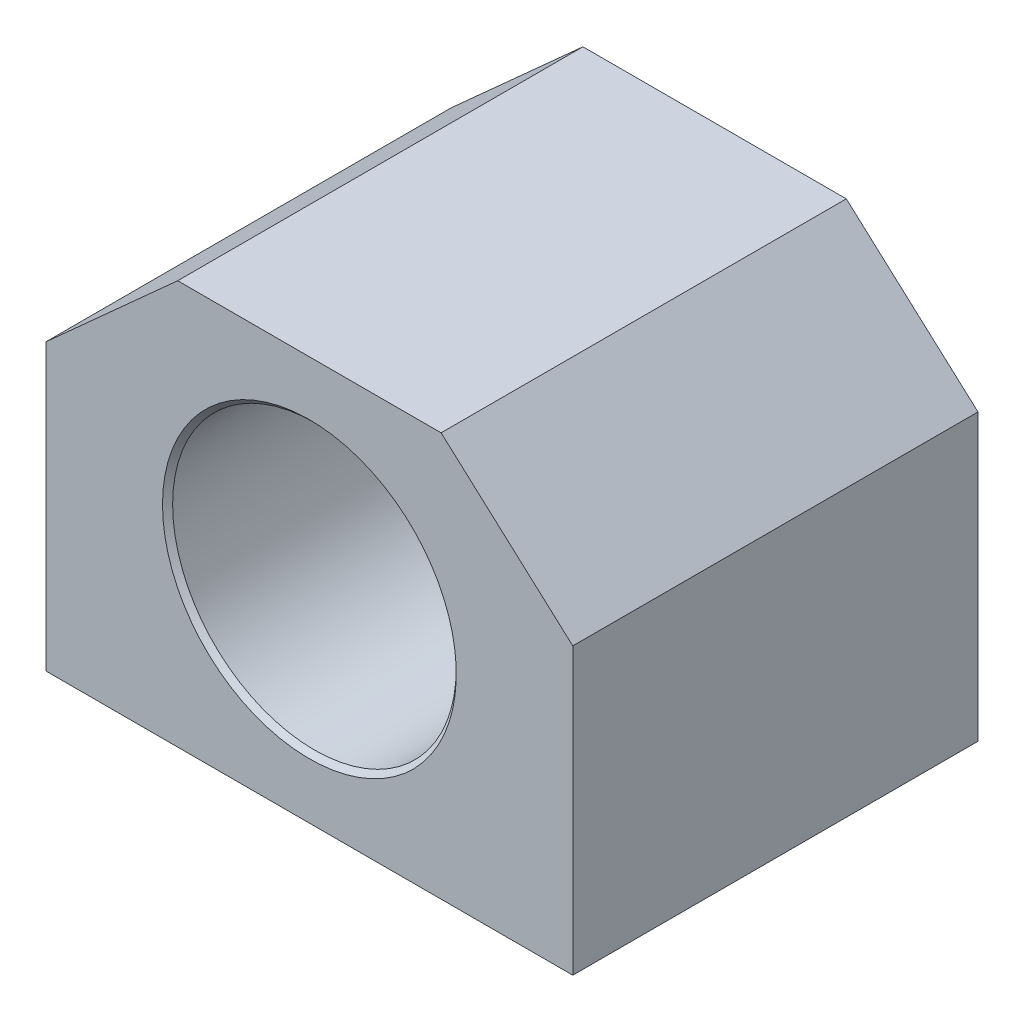
ISO-10303-21;
HEADER;
FILE_DESCRIPTION(('STEP AP214'),'2;1');
FILE_NAME('part.step','',(''),(''),'','','');
FILE_SCHEMA(('AUTOMOTIVE_DESIGN { 1 0 10303 214 1 1 1 1 }'));
ENDSEC;
DATA;
#1=APPLICATION_CONTEXT('core data for automotive mechanical design processes');
#2=APPLICATION_PROTOCOL_DEFINITION('international standard','automotive_design',2000,#1);
#3=PRODUCT_CONTEXT('',#1,'mechanical');
#4=PRODUCT('Part','Part','',(#3));
#5=PRODUCT_RELATED_PRODUCT_CATEGORY('part','',(#4));
#6=PRODUCT_DEFINITION_FORMATION('','',#4);
#7=PRODUCT_DEFINITION_CONTEXT('part definition',#1,'design');
#8=PRODUCT_DEFINITION('design','',#6,#7);
#9=PRODUCT_DEFINITION_SHAPE('','',#8);
#10=(LENGTH_UNIT() NAMED_UNIT(*) SI_UNIT(.MILLI.,.METRE.));
#11=(NAMED_UNIT(*) PLANE_ANGLE_UNIT() SI_UNIT($,.RADIAN.));
#12=(NAMED_UNIT(*) SI_UNIT($,.STERADIAN.) SOLID_ANGLE_UNIT());
#13=UNCERTAINTY_MEASURE_WITH_UNIT(LENGTH_MEASURE(1.E-05),#10,'distance_accuracy_value','');
#14=(GEOMETRIC_REPRESENTATION_CONTEXT(3) GLOBAL_UNCERTAINTY_ASSIGNED_CONTEXT((#13)) GLOBAL_UNIT_ASSIGNED_CONTEXT((#10,
#11,#12)) REPRESENTATION_CONTEXT('',''));
#15=CARTESIAN_POINT('',(0.,0.,0.));
#16=DIRECTION('',(0.,0.,1.));
#17=DIRECTION('',(1.,0.,0.));
#18=AXIS2_PLACEMENT_3D('',#15,#16,#17);
#19=CARTESIAN_POINT('',(-26.,0.,20.));
#20=DIRECTION('',(1.,0.,0.));
#21=DIRECTION('',(0.,0.,-1.));
#22=AXIS2_PLACEMENT_3D('',#19,#20,#21);
#23=PLANE('',#22);
#24=DIRECTION('',(0.,-1.,0.));
#25=VECTOR('',#24,1.);
#26=CARTESIAN_POINT('',(-26.,0.,-20.));
#27=LINE('',#26,#25);
#28=CARTESIAN_POINT('',(-26.,28.15462548614,-20.));
#29=VERTEX_POINT('',#28);
#30=CARTESIAN_POINT('',(-26.,0.,-20.));
#31=VERTEX_POINT('',#30);
#32=EDGE_CURVE('E136',#29,#31,#27,.T.);
#33=ORIENTED_EDGE('',*,*,#32,.T.);
#34=DIRECTION('',(0.,0.,-1.));
#35=VECTOR('',#34,1.);
#36=CARTESIAN_POINT('',(-26.,0.,20.));
#37=LINE('',#36,#35);
#38=CARTESIAN_POINT('',(-26.,0.,20.));
#39=VERTEX_POINT('',#38);
#40=EDGE_CURVE('E154',#39,#31,#37,.T.);
#41=ORIENTED_EDGE('',*,*,#40,.F.);
#42=DIRECTION('',(0.,-1.,0.));
#43=VECTOR('',#42,1.);
#44=CARTESIAN_POINT('',(-26.,0.,20.));
#45=LINE('',#44,#43);
#46=CARTESIAN_POINT('',(-26.,28.15462548614,20.));
#47=VERTEX_POINT('',#46);
#48=EDGE_CURVE('E147',#47,#39,#45,.T.);
#49=ORIENTED_EDGE('',*,*,#48,.F.);
#50=DIRECTION('',(0.,0.,-1.));
#51=VECTOR('',#50,1.);
#52=CARTESIAN_POINT('',(-26.,28.15462548614,20.));
#53=LINE('',#52,#51);
#54=EDGE_CURVE('E132',#47,#29,#53,.T.);
#55=ORIENTED_EDGE('',*,*,#54,.T.);
#56=EDGE_LOOP('',(#33,#41,#49,#55));
#57=FACE_BOUND('',#56,.T.);
#58=ADVANCED_FACE('F46',(#57),#23,.F.);
#59=CARTESIAN_POINT('',(26.,0.,20.));
#60=DIRECTION('',(0.,1.,0.));
#61=DIRECTION('',(0.,0.,1.));
#62=AXIS2_PLACEMENT_3D('',#59,#60,#61);
#63=PLANE('',#62);
#64=CARTESIAN_POINT('',(20.,0.,12.));
#65=DIRECTION('',(0.,-1.,0.));
#66=DIRECTION('',(0.,0.,-1.));
#67=AXIS2_PLACEMENT_3D('',#64,#65,#66);
#68=CIRCLE('',#67,2.09999999999999);
#69=CARTESIAN_POINT('',(20.,0.,9.90000000000001));
#70=VERTEX_POINT('',#69);
#71=EDGE_CURVE('E394',#70,#70,#68,.T.);
#72=ORIENTED_EDGE('',*,*,#71,.F.);
#73=EDGE_LOOP('',(#72));
#74=FACE_BOUND('',#73,.T.);
#75=CARTESIAN_POINT('',(-20.,0.,12.));
#76=DIRECTION('',(0.,-1.,0.));
#77=DIRECTION('',(0.,0.,-1.));
#78=AXIS2_PLACEMENT_3D('',#75,#76,#77);
#79=CIRCLE('',#78,2.09999999999999);
#80=CARTESIAN_POINT('',(-20.,0.,9.90000000000001));
#81=VERTEX_POINT('',#80);
#82=EDGE_CURVE('E396',#81,#81,#79,.T.);
#83=ORIENTED_EDGE('',*,*,#82,.F.);
#84=EDGE_LOOP('',(#83));
#85=FACE_BOUND('',#84,.T.);
#86=CARTESIAN_POINT('',(-20.,0.,-12.));
#87=DIRECTION('',(0.,-1.,0.));
#88=DIRECTION('',(0.,0.,-1.));
#89=AXIS2_PLACEMENT_3D('',#86,#87,#88);
#90=CIRCLE('',#89,2.09999999999999);
#91=CARTESIAN_POINT('',(-20.,0.,-14.1));
#92=VERTEX_POINT('',#91);
#93=EDGE_CURVE('E404',#92,#92,#90,.T.);
#94=ORIENTED_EDGE('',*,*,#93,.F.);
#95=EDGE_LOOP('',(#94));
#96=FACE_BOUND('',#95,.T.);
#97=CARTESIAN_POINT('',(20.,0.,-12.));
#98=DIRECTION('',(0.,-1.,0.));
#99=DIRECTION('',(0.,0.,-1.));
#100=AXIS2_PLACEMENT_3D('',#97,#98,#99);
#101=CIRCLE('',#100,2.09999999999999);
#102=CARTESIAN_POINT('',(20.,0.,-14.1));
#103=VERTEX_POINT('',#102);
#104=EDGE_CURVE('E410',#103,#103,#101,.T.);
#105=ORIENTED_EDGE('',*,*,#104,.F.);
#106=EDGE_LOOP('',(#105));
#107=FACE_BOUND('',#106,.T.);
#108=DIRECTION('',(1.,0.,0.));
#109=VECTOR('',#108,1.);
#110=CARTESIAN_POINT('',(26.,0.,-20.));
#111=LINE('',#110,#109);
#112=CARTESIAN_POINT('',(26.,0.,-20.));
#113=VERTEX_POINT('',#112);
#114=EDGE_CURVE('E139',#31,#113,#111,.T.);
#115=ORIENTED_EDGE('',*,*,#114,.T.);
#116=DIRECTION('',(0.,0.,-1.));
#117=VECTOR('',#116,1.);
#118=CARTESIAN_POINT('',(26.,0.,20.));
#119=LINE('',#118,#117);
#120=CARTESIAN_POINT('',(26.,0.,20.));
#121=VERTEX_POINT('',#120);
#122=EDGE_CURVE('E151',#121,#113,#119,.T.);
#123=ORIENTED_EDGE('',*,*,#122,.F.);
#124=DIRECTION('',(1.,0.,0.));
#125=VECTOR('',#124,1.);
#126=CARTESIAN_POINT('',(26.,0.,20.));
#127=LINE('',#126,#125);
#128=EDGE_CURVE('E103',#39,#121,#127,.T.);
#129=ORIENTED_EDGE('',*,*,#128,.F.);
#130=ORIENTED_EDGE('',*,*,#40,.T.);
#131=EDGE_LOOP('',(#115,#123,#129,#130));
#132=FACE_BOUND('',#131,.T.);
#133=ADVANCED_FACE('F192',(#74,#85,#96,#107,#132),#63,.F.);
#134=CARTESIAN_POINT('',(26.,28.15462548614,20.));
#135=DIRECTION('',(-1.,0.,0.));
#136=DIRECTION('',(0.,-1.,0.));
#137=AXIS2_PLACEMENT_3D('',#134,#135,#136);
#138=PLANE('',#137);
#139=DIRECTION('',(0.,1.,0.));
#140=VECTOR('',#139,1.);
#141=CARTESIAN_POINT('',(26.,28.15462548614,-20.));
#142=LINE('',#141,#140);
#143=CARTESIAN_POINT('',(26.,28.15462548614,-20.));
#144=VERTEX_POINT('',#143);
#145=EDGE_CURVE('E142',#113,#144,#142,.T.);
#146=ORIENTED_EDGE('',*,*,#145,.T.);
#147=DIRECTION('',(0.,0.,-1.));
#148=VECTOR('',#147,1.);
#149=CARTESIAN_POINT('',(26.,28.15462548614,20.));
#150=LINE('',#149,#148);
#151=CARTESIAN_POINT('',(26.,28.15462548614,20.));
#152=VERTEX_POINT('',#151);
#153=EDGE_CURVE('E127',#152,#144,#150,.T.);
#154=ORIENTED_EDGE('',*,*,#153,.F.);
#155=DIRECTION('',(0.,1.,0.));
#156=VECTOR('',#155,1.);
#157=CARTESIAN_POINT('',(26.,28.15462548614,20.));
#158=LINE('',#157,#156);
#159=EDGE_CURVE('E118',#121,#152,#158,.T.);
#160=ORIENTED_EDGE('',*,*,#159,.F.);
#161=ORIENTED_EDGE('',*,*,#122,.T.);
#162=EDGE_LOOP('',(#146,#154,#160,#161));
#163=FACE_BOUND('',#162,.T.);
#164=ADVANCED_FACE('F197',(#163),#138,.F.);
#165=CARTESIAN_POINT('',(13.,39.87,20.));
#166=DIRECTION('',(-0.66944997222057,-0.742857142857143,0.));
#167=DIRECTION('',(0.742857142857143,-0.66944997222057,0.));
#168=AXIS2_PLACEMENT_3D('',#165,#166,#167);
#169=PLANE('',#168);
#170=DIRECTION('',(-0.742857142857143,0.66944997222057,0.));
#171=VECTOR('',#170,1.);
#172=CARTESIAN_POINT('',(13.,39.87,-20.));
#173=LINE('',#172,#171);
#174=CARTESIAN_POINT('',(13.,39.87,-20.));
#175=VERTEX_POINT('',#174);
#176=EDGE_CURVE('E126',#144,#175,#173,.T.);
#177=ORIENTED_EDGE('',*,*,#176,.T.);
#178=DIRECTION('',(0.,0.,-1.));
#179=VECTOR('',#178,1.);
#180=CARTESIAN_POINT('',(13.,39.87,20.));
#181=LINE('',#180,#179);
#182=CARTESIAN_POINT('',(13.,39.87,20.));
#183=VERTEX_POINT('',#182);
#184=EDGE_CURVE('E123',#183,#175,#181,.T.);
#185=ORIENTED_EDGE('',*,*,#184,.F.);
#186=DIRECTION('',(-0.742857142857143,0.66944997222057,0.));
#187=VECTOR('',#186,1.);
#188=CARTESIAN_POINT('',(13.,39.87,20.));
#189=LINE('',#188,#187);
#190=EDGE_CURVE('E112',#152,#183,#189,.T.);
#191=ORIENTED_EDGE('',*,*,#190,.F.);
#192=ORIENTED_EDGE('',*,*,#153,.T.);
#193=EDGE_LOOP('',(#177,#185,#191,#192));
#194=FACE_BOUND('',#193,.T.);
#195=ADVANCED_FACE('F124',(#194),#169,.F.);
#196=CARTESIAN_POINT('',(-13.,39.87,20.));
#197=DIRECTION('',(0.,-1.,0.));
#198=DIRECTION('',(0.,0.,-1.));
#199=AXIS2_PLACEMENT_3D('',#196,#197,#198);
#200=PLANE('',#199);
#201=DIRECTION('',(-1.,0.,0.));
#202=VECTOR('',#201,1.);
#203=CARTESIAN_POINT('',(-13.,39.87,-20.));
#204=LINE('',#203,#202);
#205=CARTESIAN_POINT('',(-13.,39.87,-20.));
#206=VERTEX_POINT('',#205);
#207=EDGE_CURVE('E88',#175,#206,#204,.T.);
#208=ORIENTED_EDGE('',*,*,#207,.T.);
#209=DIRECTION('',(0.,0.,-1.));
#210=VECTOR('',#209,1.);
#211=CARTESIAN_POINT('',(-13.,39.87,20.));
#212=LINE('',#211,#210);
#213=CARTESIAN_POINT('',(-13.,39.87,20.));
#214=VERTEX_POINT('',#213);
#215=EDGE_CURVE('E128',#214,#206,#212,.T.);
#216=ORIENTED_EDGE('',*,*,#215,.F.);
#217=DIRECTION('',(-1.,0.,0.));
#218=VECTOR('',#217,1.);
#219=CARTESIAN_POINT('',(-13.,39.87,20.));
#220=LINE('',#219,#218);
#221=EDGE_CURVE('E116',#183,#214,#220,.T.);
#222=ORIENTED_EDGE('',*,*,#221,.F.);
#223=ORIENTED_EDGE('',*,*,#184,.T.);
#224=EDGE_LOOP('',(#208,#216,#222,#223));
#225=FACE_BOUND('',#224,.T.);
#226=ADVANCED_FACE('F130',(#225),#200,.F.);
#227=CARTESIAN_POINT('',(-26.,28.15462548614,20.));
#228=DIRECTION('',(0.669449972220571,-0.742857142857143,0.));
#229=DIRECTION('',(0.742857142857143,0.669449972220571,0.));
#230=AXIS2_PLACEMENT_3D('',#227,#228,#229);
#231=PLANE('',#230);
#232=DIRECTION('',(-0.742857142857143,-0.669449972220571,0.));
#233=VECTOR('',#232,1.);
#234=CARTESIAN_POINT('',(-26.,28.15462548614,-20.));
#235=LINE('',#234,#233);
#236=EDGE_CURVE('E94',#206,#29,#235,.T.);
#237=ORIENTED_EDGE('',*,*,#236,.T.);
#238=ORIENTED_EDGE('',*,*,#54,.F.);
#239=DIRECTION('',(-0.742857142857143,-0.669449972220571,0.));
#240=VECTOR('',#239,1.);
#241=CARTESIAN_POINT('',(-26.,28.15462548614,20.));
#242=LINE('',#241,#240);
#243=EDGE_CURVE('E64',#214,#47,#242,.T.);
#244=ORIENTED_EDGE('',*,*,#243,.F.);
#245=ORIENTED_EDGE('',*,*,#215,.T.);
#246=EDGE_LOOP('',(#237,#238,#244,#245));
#247=FACE_BOUND('',#246,.T.);
#248=ADVANCED_FACE('F181',(#247),#231,.F.);
#249=CARTESIAN_POINT('',(0.,0.,20.));
#250=DIRECTION('',(0.,0.,-1.));
#251=DIRECTION('',(-1.,0.,0.));
#252=AXIS2_PLACEMENT_3D('',#249,#250,#251);
#253=PLANE('',#252);
#254=CARTESIAN_POINT('',(0.,20.,20.));
#255=DIRECTION('',(0.,0.,-1.));
#256=DIRECTION('',(-1.,0.,0.));
#257=AXIS2_PLACEMENT_3D('',#254,#255,#256);
#258=CIRCLE('',#257,14.5);
#259=CARTESIAN_POINT('',(-14.5,20.,20.));
#260=VERTEX_POINT('',#259);
#261=EDGE_CURVE('E11',#260,#260,#258,.T.);
#262=ORIENTED_EDGE('',*,*,#261,.T.);
#263=EDGE_LOOP('',(#262));
#264=FACE_BOUND('',#263,.T.);
#265=ORIENTED_EDGE('',*,*,#48,.T.);
#266=ORIENTED_EDGE('',*,*,#128,.T.);
#267=ORIENTED_EDGE('',*,*,#159,.T.);
#268=ORIENTED_EDGE('',*,*,#190,.T.);
#269=ORIENTED_EDGE('',*,*,#221,.T.);
#270=ORIENTED_EDGE('',*,*,#243,.T.);
#271=EDGE_LOOP('',(#265,#266,#267,#268,#269,#270));
#272=FACE_BOUND('',#271,.T.);
#273=ADVANCED_FACE('F114',(#264,#272),#253,.F.);
#274=CARTESIAN_POINT('',(0.,0.,-20.));
#275=DIRECTION('',(0.,0.,-1.));
#276=DIRECTION('',(-1.,0.,0.));
#277=AXIS2_PLACEMENT_3D('',#274,#275,#276);
#278=PLANE('',#277);
#279=CARTESIAN_POINT('',(0.,20.,-20.));
#280=DIRECTION('',(0.,0.,-1.));
#281=DIRECTION('',(-1.,0.,0.));
#282=AXIS2_PLACEMENT_3D('',#279,#280,#281);
#283=CIRCLE('',#282,14.5);
#284=CARTESIAN_POINT('',(-14.5,20.,-20.));
#285=VERTEX_POINT('',#284);
#286=EDGE_CURVE('E156',#285,#285,#283,.F.);
#287=ORIENTED_EDGE('',*,*,#286,.T.);
#288=EDGE_LOOP('',(#287));
#289=FACE_BOUND('',#288,.T.);
#290=ORIENTED_EDGE('',*,*,#32,.F.);
#291=ORIENTED_EDGE('',*,*,#236,.F.);
#292=ORIENTED_EDGE('',*,*,#207,.F.);
#293=ORIENTED_EDGE('',*,*,#176,.F.);
#294=ORIENTED_EDGE('',*,*,#145,.F.);
#295=ORIENTED_EDGE('',*,*,#114,.F.);
#296=EDGE_LOOP('',(#290,#291,#292,#293,#294,#295));
#297=FACE_BOUND('',#296,.T.);
#298=ADVANCED_FACE('F172',(#289,#297),#278,.T.);
#299=CARTESIAN_POINT('',(0.,20.,-20.));
#300=DIRECTION('',(0.,0.,1.));
#301=DIRECTION('',(1.,0.,0.));
#302=AXIS2_PLACEMENT_3D('',#299,#300,#301);
#303=CYLINDRICAL_SURFACE('',#302,14.);
#304=CARTESIAN_POINT('',(0.,20.,-19.5));
#305=DIRECTION('',(0.,0.,-1.));
#306=DIRECTION('',(-1.,0.,0.));
#307=AXIS2_PLACEMENT_3D('',#304,#305,#306);
#308=CIRCLE('',#307,14.);
#309=CARTESIAN_POINT('',(-14.,20.,-19.5));
#310=VERTEX_POINT('',#309);
#311=EDGE_CURVE('E56',#310,#310,#308,.T.);
#312=ORIENTED_EDGE('',*,*,#311,.T.);
#313=EDGE_LOOP('',(#312));
#314=FACE_BOUND('',#313,.T.);
#315=CARTESIAN_POINT('',(0.,20.,19.5));
#316=DIRECTION('',(0.,0.,-1.));
#317=DIRECTION('',(-1.,0.,0.));
#318=AXIS2_PLACEMENT_3D('',#315,#316,#317);
#319=CIRCLE('',#318,14.);
#320=CARTESIAN_POINT('',(-14.,20.,19.5));
#321=VERTEX_POINT('',#320);
#322=EDGE_CURVE('E159',#321,#321,#319,.F.);
#323=ORIENTED_EDGE('',*,*,#322,.T.);
#324=EDGE_LOOP('',(#323));
#325=FACE_BOUND('',#324,.T.);
#326=ADVANCED_FACE('F164',(#314,#325),#303,.F.);
#327=CARTESIAN_POINT('',(0.,20.,-20.));
#328=DIRECTION('',(0.,0.,-1.));
#329=DIRECTION('',(-1.,0.,0.));
#330=AXIS2_PLACEMENT_3D('',#327,#328,#329);
#331=CONICAL_SURFACE('',#330,14.5,0.785398163397447);
#332=ORIENTED_EDGE('',*,*,#311,.F.);
#333=EDGE_LOOP('',(#332));
#334=FACE_BOUND('',#333,.T.);
#335=ORIENTED_EDGE('',*,*,#286,.F.);
#336=EDGE_LOOP('',(#335));
#337=FACE_BOUND('',#336,.T.);
#338=ADVANCED_FACE('F167',(#334,#337),#331,.F.);
#339=CARTESIAN_POINT('',(0.,20.,19.5));
#340=DIRECTION('',(0.,0.,1.));
#341=DIRECTION('',(1.,0.,0.));
#342=AXIS2_PLACEMENT_3D('',#339,#340,#341);
#343=CONICAL_SURFACE('',#342,14.,0.785398163397448);
#344=ORIENTED_EDGE('',*,*,#261,.F.);
#345=EDGE_LOOP('',(#344));
#346=FACE_BOUND('',#345,.T.);
#347=ORIENTED_EDGE('',*,*,#322,.F.);
#348=EDGE_LOOP('',(#347));
#349=FACE_BOUND('',#348,.T.);
#350=ADVANCED_FACE('F49',(#346,#349),#343,.F.);
#351=CARTESIAN_POINT('',(20.,16.,-12.));
#352=DIRECTION('',(0.,-1.,0.));
#353=DIRECTION('',(0.,0.,-1.));
#354=AXIS2_PLACEMENT_3D('',#351,#352,#353);
#355=CONICAL_SURFACE('',#354,2.1,1.02974425867665);
#356=CARTESIAN_POINT('',(20.,17.2618072999579,-12.));
#357=VERTEX_POINT('',#356);
#358=VERTEX_LOOP('',#357);
#359=FACE_BOUND('',#358,.T.);
#360=CARTESIAN_POINT('',(20.,16.,-12.));
#361=DIRECTION('',(0.,-1.,0.));
#362=DIRECTION('',(0.,0.,-1.));
#363=AXIS2_PLACEMENT_3D('',#360,#361,#362);
#364=CIRCLE('',#363,2.1);
#365=CARTESIAN_POINT('',(20.,16.,-14.1));
#366=VERTEX_POINT('',#365);
#367=EDGE_CURVE('E140',#366,#366,#364,.T.);
#368=ORIENTED_EDGE('',*,*,#367,.T.);
#369=EDGE_LOOP('',(#368));
#370=FACE_BOUND('',#369,.T.);
#371=ADVANCED_FACE('F257',(#359,#370),#355,.F.);
#372=CARTESIAN_POINT('',(20.,0.,-12.));
#373=DIRECTION('',(0.,-1.,0.));
#374=DIRECTION('',(0.,0.,-1.));
#375=AXIS2_PLACEMENT_3D('',#372,#373,#374);
#376=CYLINDRICAL_SURFACE('',#375,2.09999999999999);
#377=ORIENTED_EDGE('',*,*,#367,.F.);
#378=EDGE_LOOP('',(#377));
#379=FACE_BOUND('',#378,.T.);
#380=ORIENTED_EDGE('',*,*,#104,.T.);
#381=EDGE_LOOP('',(#380));
#382=FACE_BOUND('',#381,.T.);
#383=ADVANCED_FACE('F277',(#379,#382),#376,.F.);
#384=CARTESIAN_POINT('',(-20.,16.,-12.));
#385=DIRECTION('',(0.,-1.,0.));
#386=DIRECTION('',(0.,0.,-1.));
#387=AXIS2_PLACEMENT_3D('',#384,#385,#386);
#388=CONICAL_SURFACE('',#387,2.1,1.02974425867665);
#389=CARTESIAN_POINT('',(-20.,17.2618072999579,-12.));
#390=VERTEX_POINT('',#389);
#391=VERTEX_LOOP('',#390);
#392=FACE_BOUND('',#391,.T.);
#393=CARTESIAN_POINT('',(-20.,16.,-12.));
#394=DIRECTION('',(0.,-1.,0.));
#395=DIRECTION('',(0.,0.,-1.));
#396=AXIS2_PLACEMENT_3D('',#393,#394,#395);
#397=CIRCLE('',#396,2.1);
#398=CARTESIAN_POINT('',(-20.,16.,-14.1));
#399=VERTEX_POINT('',#398);
#400=EDGE_CURVE('E407',#399,#399,#397,.T.);
#401=ORIENTED_EDGE('',*,*,#400,.T.);
#402=EDGE_LOOP('',(#401));
#403=FACE_BOUND('',#402,.T.);
#404=ADVANCED_FACE('F288',(#392,#403),#388,.F.);
#405=CARTESIAN_POINT('',(-20.,0.,-12.));
#406=DIRECTION('',(0.,-1.,0.));
#407=DIRECTION('',(0.,0.,-1.));
#408=AXIS2_PLACEMENT_3D('',#405,#406,#407);
#409=CYLINDRICAL_SURFACE('',#408,2.09999999999999);
#410=ORIENTED_EDGE('',*,*,#400,.F.);
#411=EDGE_LOOP('',(#410));
#412=FACE_BOUND('',#411,.T.);
#413=ORIENTED_EDGE('',*,*,#93,.T.);
#414=EDGE_LOOP('',(#413));
#415=FACE_BOUND('',#414,.T.);
#416=ADVANCED_FACE('F299',(#412,#415),#409,.F.);
#417=CARTESIAN_POINT('',(-20.,16.,12.));
#418=DIRECTION('',(0.,-1.,0.));
#419=DIRECTION('',(0.,0.,-1.));
#420=AXIS2_PLACEMENT_3D('',#417,#418,#419);
#421=CONICAL_SURFACE('',#420,2.1,1.02974425867665);
#422=CARTESIAN_POINT('',(-20.,17.2618072999579,12.));
#423=VERTEX_POINT('',#422);
#424=VERTEX_LOOP('',#423);
#425=FACE_BOUND('',#424,.T.);
#426=CARTESIAN_POINT('',(-20.,16.,12.));
#427=DIRECTION('',(0.,-1.,0.));
#428=DIRECTION('',(0.,0.,-1.));
#429=AXIS2_PLACEMENT_3D('',#426,#427,#428);
#430=CIRCLE('',#429,2.1);
#431=CARTESIAN_POINT('',(-20.,16.,9.9));
#432=VERTEX_POINT('',#431);
#433=EDGE_CURVE('E401',#432,#432,#430,.T.);
#434=ORIENTED_EDGE('',*,*,#433,.T.);
#435=EDGE_LOOP('',(#434));
#436=FACE_BOUND('',#435,.T.);
#437=ADVANCED_FACE('F309',(#425,#436),#421,.F.);
#438=CARTESIAN_POINT('',(-20.,0.,12.));
#439=DIRECTION('',(0.,-1.,0.));
#440=DIRECTION('',(0.,0.,-1.));
#441=AXIS2_PLACEMENT_3D('',#438,#439,#440);
#442=CYLINDRICAL_SURFACE('',#441,2.09999999999999);
#443=ORIENTED_EDGE('',*,*,#433,.F.);
#444=EDGE_LOOP('',(#443));
#445=FACE_BOUND('',#444,.T.);
#446=ORIENTED_EDGE('',*,*,#82,.T.);
#447=EDGE_LOOP('',(#446));
#448=FACE_BOUND('',#447,.T.);
#449=ADVANCED_FACE('F321',(#445,#448),#442,.F.);
#450=CARTESIAN_POINT('',(20.,16.,12.));
#451=DIRECTION('',(0.,-1.,0.));
#452=DIRECTION('',(0.,0.,-1.));
#453=AXIS2_PLACEMENT_3D('',#450,#451,#452);
#454=CONICAL_SURFACE('',#453,2.1,1.02974425867665);
#455=CARTESIAN_POINT('',(20.,17.2618072999579,12.));
#456=VERTEX_POINT('',#455);
#457=VERTEX_LOOP('',#456);
#458=FACE_BOUND('',#457,.T.);
#459=CARTESIAN_POINT('',(20.,16.,12.));
#460=DIRECTION('',(0.,-1.,0.));
#461=DIRECTION('',(0.,0.,-1.));
#462=AXIS2_PLACEMENT_3D('',#459,#460,#461);
#463=CIRCLE('',#462,2.1);
#464=CARTESIAN_POINT('',(20.,16.,9.9));
#465=VERTEX_POINT('',#464);
#466=EDGE_CURVE('E391',#465,#465,#463,.T.);
#467=ORIENTED_EDGE('',*,*,#466,.T.);
#468=EDGE_LOOP('',(#467));
#469=FACE_BOUND('',#468,.T.);
#470=ADVANCED_FACE('F331',(#458,#469),#454,.F.);
#471=CARTESIAN_POINT('',(20.,0.,12.));
#472=DIRECTION('',(0.,-1.,0.));
#473=DIRECTION('',(0.,0.,-1.));
#474=AXIS2_PLACEMENT_3D('',#471,#472,#473);
#475=CYLINDRICAL_SURFACE('',#474,2.09999999999999);
#476=ORIENTED_EDGE('',*,*,#466,.F.);
#477=EDGE_LOOP('',(#476));
#478=FACE_BOUND('',#477,.T.);
#479=ORIENTED_EDGE('',*,*,#71,.T.);
#480=EDGE_LOOP('',(#479));
#481=FACE_BOUND('',#480,.T.);
#482=ADVANCED_FACE('F343',(#478,#481),#475,.F.);
#483=CLOSED_SHELL('',(#58,#133,#164,#195,#226,#248,#273,#298,#326,#338,#350,#371,#383,#404,#416,
#437,#449,#470,#482));
#484=MANIFOLD_SOLID_BREP('B2',#483);
#485=ADVANCED_BREP_SHAPE_REPRESENTATION('',(#18,#484),#14);
#486=SHAPE_DEFINITION_REPRESENTATION(#9,#485);
ENDSEC;
END-ISO-10303-21;
